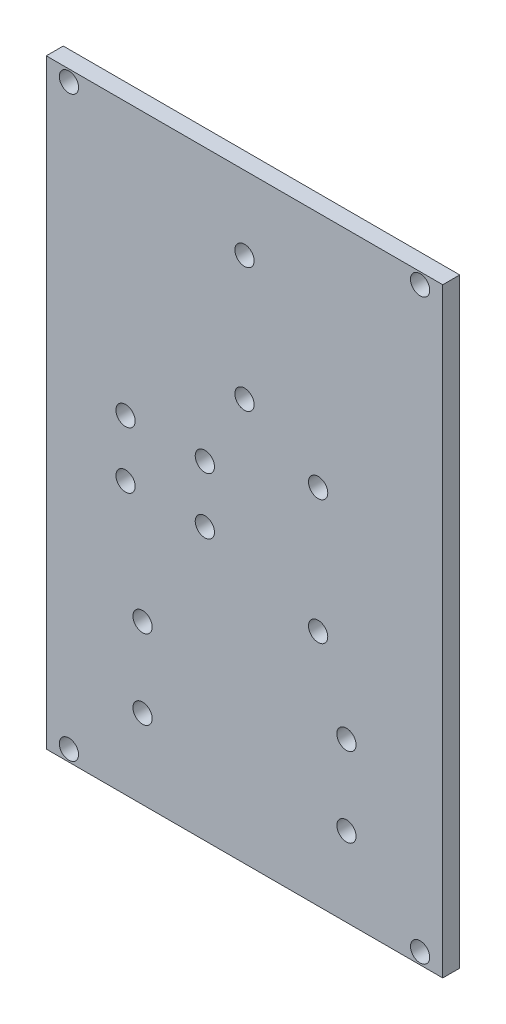
ISO-10303-21;
HEADER;
FILE_DESCRIPTION(('STEP AP214'),'2;1');
FILE_NAME('part.step','',(''),(''),'','','');
FILE_SCHEMA(('AUTOMOTIVE_DESIGN { 1 0 10303 214 1 1 1 1 }'));
ENDSEC;
DATA;
#1=APPLICATION_CONTEXT('core data for automotive mechanical design processes');
#2=APPLICATION_PROTOCOL_DEFINITION('international standard','automotive_design',2000,#1);
#3=PRODUCT_CONTEXT('',#1,'mechanical');
#4=PRODUCT('Part','Part','',(#3));
#5=PRODUCT_RELATED_PRODUCT_CATEGORY('part','',(#4));
#6=PRODUCT_DEFINITION_FORMATION('','',#4);
#7=PRODUCT_DEFINITION_CONTEXT('part definition',#1,'design');
#8=PRODUCT_DEFINITION('design','',#6,#7);
#9=PRODUCT_DEFINITION_SHAPE('','',#8);
#10=(LENGTH_UNIT() NAMED_UNIT(*) SI_UNIT(.MILLI.,.METRE.));
#11=(NAMED_UNIT(*) PLANE_ANGLE_UNIT() SI_UNIT($,.RADIAN.));
#12=(NAMED_UNIT(*) SI_UNIT($,.STERADIAN.) SOLID_ANGLE_UNIT());
#13=UNCERTAINTY_MEASURE_WITH_UNIT(LENGTH_MEASURE(1.E-05),#10,'distance_accuracy_value','');
#14=(GEOMETRIC_REPRESENTATION_CONTEXT(3) GLOBAL_UNCERTAINTY_ASSIGNED_CONTEXT((#13)) GLOBAL_UNIT_ASSIGNED_CONTEXT((#10,
#11,#12)) REPRESENTATION_CONTEXT('',''));
#15=CARTESIAN_POINT('',(0.,0.,0.));
#16=DIRECTION('',(0.,0.,1.));
#17=DIRECTION('',(1.,0.,0.));
#18=AXIS2_PLACEMENT_3D('',#15,#16,#17);
#19=CARTESIAN_POINT('',(-238.,53.,85.));
#20=DIRECTION('',(-1.,0.,0.));
#21=DIRECTION('',(0.,0.,1.));
#22=AXIS2_PLACEMENT_3D('',#19,#20,#21);
#23=PLANE('',#22);
#24=DIRECTION('',(0.,-1.,0.));
#25=VECTOR('',#24,1.);
#26=CARTESIAN_POINT('',(-238.,53.,88.));
#27=LINE('',#26,#25);
#28=CARTESIAN_POINT('',(-238.,53.,88.));
#29=VERTEX_POINT('',#28);
#30=CARTESIAN_POINT('',(-238.,-53.,88.));
#31=VERTEX_POINT('',#30);
#32=EDGE_CURVE('E106',#29,#31,#27,.T.);
#33=ORIENTED_EDGE('',*,*,#32,.F.);
#34=DIRECTION('',(0.,0.,1.));
#35=VECTOR('',#34,1.);
#36=CARTESIAN_POINT('',(-238.,53.,85.));
#37=LINE('',#36,#35);
#38=CARTESIAN_POINT('',(-238.,53.,85.));
#39=VERTEX_POINT('',#38);
#40=EDGE_CURVE('E11',#39,#29,#37,.T.);
#41=ORIENTED_EDGE('',*,*,#40,.F.);
#42=DIRECTION('',(0.,-1.,0.));
#43=VECTOR('',#42,1.);
#44=CARTESIAN_POINT('',(-238.,53.,85.));
#45=LINE('',#44,#43);
#46=CARTESIAN_POINT('',(-238.,-53.,85.));
#47=VERTEX_POINT('',#46);
#48=EDGE_CURVE('E97',#39,#47,#45,.T.);
#49=ORIENTED_EDGE('',*,*,#48,.T.);
#50=DIRECTION('',(0.,0.,1.));
#51=VECTOR('',#50,1.);
#52=CARTESIAN_POINT('',(-238.,-53.,85.));
#53=LINE('',#52,#51);
#54=EDGE_CURVE('E42',#47,#31,#53,.T.);
#55=ORIENTED_EDGE('',*,*,#54,.T.);
#56=EDGE_LOOP('',(#33,#41,#49,#55));
#57=FACE_BOUND('',#56,.T.);
#58=ADVANCED_FACE('F41',(#57),#23,.T.);
#59=CARTESIAN_POINT('',(-238.,53.,85.));
#60=DIRECTION('',(0.,1.,0.));
#61=DIRECTION('',(0.,0.,1.));
#62=AXIS2_PLACEMENT_3D('',#59,#60,#61);
#63=PLANE('',#62);
#64=DIRECTION('',(-1.,0.,0.));
#65=VECTOR('',#64,1.);
#66=CARTESIAN_POINT('',(-238.,53.,88.));
#67=LINE('',#66,#65);
#68=CARTESIAN_POINT('',(-168.,53.,88.));
#69=VERTEX_POINT('',#68);
#70=EDGE_CURVE('E101',#69,#29,#67,.T.);
#71=ORIENTED_EDGE('',*,*,#70,.F.);
#72=DIRECTION('',(0.,0.,1.));
#73=VECTOR('',#72,1.);
#74=CARTESIAN_POINT('',(-168.,53.,85.));
#75=LINE('',#74,#73);
#76=CARTESIAN_POINT('',(-168.,53.,85.));
#77=VERTEX_POINT('',#76);
#78=EDGE_CURVE('E49',#77,#69,#75,.T.);
#79=ORIENTED_EDGE('',*,*,#78,.F.);
#80=DIRECTION('',(-1.,0.,0.));
#81=VECTOR('',#80,1.);
#82=CARTESIAN_POINT('',(-238.,53.,85.));
#83=LINE('',#82,#81);
#84=EDGE_CURVE('E96',#77,#39,#83,.T.);
#85=ORIENTED_EDGE('',*,*,#84,.T.);
#86=ORIENTED_EDGE('',*,*,#40,.T.);
#87=EDGE_LOOP('',(#71,#79,#85,#86));
#88=FACE_BOUND('',#87,.T.);
#89=ADVANCED_FACE('F120',(#88),#63,.T.);
#90=CARTESIAN_POINT('',(-168.,53.,85.));
#91=DIRECTION('',(1.,0.,0.));
#92=DIRECTION('',(0.,0.,-1.));
#93=AXIS2_PLACEMENT_3D('',#90,#91,#92);
#94=PLANE('',#93);
#95=DIRECTION('',(0.,1.,0.));
#96=VECTOR('',#95,1.);
#97=CARTESIAN_POINT('',(-168.,53.,88.));
#98=LINE('',#97,#96);
#99=CARTESIAN_POINT('',(-168.,-53.,88.));
#100=VERTEX_POINT('',#99);
#101=EDGE_CURVE('E93',#100,#69,#98,.T.);
#102=ORIENTED_EDGE('',*,*,#101,.F.);
#103=DIRECTION('',(0.,0.,1.));
#104=VECTOR('',#103,1.);
#105=CARTESIAN_POINT('',(-168.,-53.,85.));
#106=LINE('',#105,#104);
#107=CARTESIAN_POINT('',(-168.,-53.,85.));
#108=VERTEX_POINT('',#107);
#109=EDGE_CURVE('E88',#108,#100,#106,.T.);
#110=ORIENTED_EDGE('',*,*,#109,.F.);
#111=DIRECTION('',(0.,1.,0.));
#112=VECTOR('',#111,1.);
#113=CARTESIAN_POINT('',(-168.,53.,85.));
#114=LINE('',#113,#112);
#115=EDGE_CURVE('E90',#108,#77,#114,.T.);
#116=ORIENTED_EDGE('',*,*,#115,.T.);
#117=ORIENTED_EDGE('',*,*,#78,.T.);
#118=EDGE_LOOP('',(#102,#110,#116,#117));
#119=FACE_BOUND('',#118,.T.);
#120=ADVANCED_FACE('F86',(#119),#94,.T.);
#121=CARTESIAN_POINT('',(-238.,-53.,85.));
#122=DIRECTION('',(0.,-1.,0.));
#123=DIRECTION('',(0.,0.,-1.));
#124=AXIS2_PLACEMENT_3D('',#121,#122,#123);
#125=PLANE('',#124);
#126=DIRECTION('',(1.,0.,0.));
#127=VECTOR('',#126,1.);
#128=CARTESIAN_POINT('',(-238.,-53.,88.));
#129=LINE('',#128,#127);
#130=EDGE_CURVE('E108',#31,#100,#129,.T.);
#131=ORIENTED_EDGE('',*,*,#130,.F.);
#132=ORIENTED_EDGE('',*,*,#54,.F.);
#133=DIRECTION('',(1.,0.,0.));
#134=VECTOR('',#133,1.);
#135=CARTESIAN_POINT('',(-238.,-53.,85.));
#136=LINE('',#135,#134);
#137=EDGE_CURVE('E92',#47,#108,#136,.T.);
#138=ORIENTED_EDGE('',*,*,#137,.T.);
#139=ORIENTED_EDGE('',*,*,#109,.T.);
#140=EDGE_LOOP('',(#131,#132,#138,#139));
#141=FACE_BOUND('',#140,.T.);
#142=ADVANCED_FACE('F98',(#141),#125,.T.);
#143=CARTESIAN_POINT('',(0.,0.,85.));
#144=DIRECTION('',(0.,0.,1.));
#145=DIRECTION('',(1.,0.,0.));
#146=AXIS2_PLACEMENT_3D('',#143,#144,#145);
#147=PLANE('',#146);
#148=CARTESIAN_POINT('',(-172.,51.,85.));
#149=DIRECTION('',(0.,0.,1.));
#150=DIRECTION('',(1.,0.,0.));
#151=AXIS2_PLACEMENT_3D('',#148,#149,#150);
#152=CIRCLE('',#151,1.70000000000001);
#153=CARTESIAN_POINT('',(-170.3,51.,85.));
#154=VERTEX_POINT('',#153);
#155=EDGE_CURVE('E206',#154,#154,#152,.T.);
#156=ORIENTED_EDGE('',*,*,#155,.T.);
#157=EDGE_LOOP('',(#156));
#158=FACE_BOUND('',#157,.T.);
#159=CARTESIAN_POINT('',(-203.,40.,85.));
#160=DIRECTION('',(0.,0.,1.));
#161=DIRECTION('',(1.,0.,0.));
#162=AXIS2_PLACEMENT_3D('',#159,#160,#161);
#163=CIRCLE('',#162,1.70000000000001);
#164=CARTESIAN_POINT('',(-201.3,40.,85.));
#165=VERTEX_POINT('',#164);
#166=EDGE_CURVE('E212',#165,#165,#163,.T.);
#167=ORIENTED_EDGE('',*,*,#166,.T.);
#168=EDGE_LOOP('',(#167));
#169=FACE_BOUND('',#168,.T.);
#170=CARTESIAN_POINT('',(-203.,18.,85.));
#171=DIRECTION('',(0.,0.,1.));
#172=DIRECTION('',(1.,0.,0.));
#173=AXIS2_PLACEMENT_3D('',#170,#171,#172);
#174=CIRCLE('',#173,1.70000000000001);
#175=CARTESIAN_POINT('',(-201.3,18.,85.));
#176=VERTEX_POINT('',#175);
#177=EDGE_CURVE('E219',#176,#176,#174,.T.);
#178=ORIENTED_EDGE('',*,*,#177,.T.);
#179=EDGE_LOOP('',(#178));
#180=FACE_BOUND('',#179,.T.);
#181=CARTESIAN_POINT('',(-190.,11.,85.));
#182=DIRECTION('',(0.,0.,1.));
#183=DIRECTION('',(1.,0.,0.));
#184=AXIS2_PLACEMENT_3D('',#181,#182,#183);
#185=CIRCLE('',#184,1.70000000000001);
#186=CARTESIAN_POINT('',(-188.3,11.,85.));
#187=VERTEX_POINT('',#186);
#188=EDGE_CURVE('E227',#187,#187,#185,.T.);
#189=ORIENTED_EDGE('',*,*,#188,.T.);
#190=EDGE_LOOP('',(#189));
#191=FACE_BOUND('',#190,.T.);
#192=CARTESIAN_POINT('',(-234.,51.,85.));
#193=DIRECTION('',(0.,0.,1.));
#194=DIRECTION('',(1.,0.,0.));
#195=AXIS2_PLACEMENT_3D('',#192,#193,#194);
#196=CIRCLE('',#195,1.70000000000001);
#197=CARTESIAN_POINT('',(-232.3,51.,85.));
#198=VERTEX_POINT('',#197);
#199=EDGE_CURVE('E235',#198,#198,#196,.T.);
#200=ORIENTED_EDGE('',*,*,#199,.T.);
#201=EDGE_LOOP('',(#200));
#202=FACE_BOUND('',#201,.T.);
#203=CARTESIAN_POINT('',(-210.,5.,85.));
#204=DIRECTION('',(0.,0.,1.));
#205=DIRECTION('',(1.,0.,0.));
#206=AXIS2_PLACEMENT_3D('',#203,#204,#205);
#207=CIRCLE('',#206,1.70000000000001);
#208=CARTESIAN_POINT('',(-208.3,5.,85.));
#209=VERTEX_POINT('',#208);
#210=EDGE_CURVE('E236',#209,#209,#207,.T.);
#211=ORIENTED_EDGE('',*,*,#210,.T.);
#212=EDGE_LOOP('',(#211));
#213=FACE_BOUND('',#212,.T.);
#214=CARTESIAN_POINT('',(-224.,5.,85.));
#215=DIRECTION('',(0.,0.,1.));
#216=DIRECTION('',(1.,0.,0.));
#217=AXIS2_PLACEMENT_3D('',#214,#215,#216);
#218=CIRCLE('',#217,1.70000000000001);
#219=CARTESIAN_POINT('',(-222.3,5.,85.));
#220=VERTEX_POINT('',#219);
#221=EDGE_CURVE('E241',#220,#220,#218,.T.);
#222=ORIENTED_EDGE('',*,*,#221,.T.);
#223=EDGE_LOOP('',(#222));
#224=FACE_BOUND('',#223,.T.);
#225=CARTESIAN_POINT('',(-185.,-25.,85.));
#226=DIRECTION('',(0.,0.,1.));
#227=DIRECTION('',(1.,0.,0.));
#228=AXIS2_PLACEMENT_3D('',#225,#226,#227);
#229=CIRCLE('',#228,1.70000000000001);
#230=CARTESIAN_POINT('',(-183.3,-25.,85.));
#231=VERTEX_POINT('',#230);
#232=EDGE_CURVE('E248',#231,#231,#229,.T.);
#233=ORIENTED_EDGE('',*,*,#232,.T.);
#234=EDGE_LOOP('',(#233));
#235=FACE_BOUND('',#234,.T.);
#236=CARTESIAN_POINT('',(-190.,-11.,85.));
#237=DIRECTION('',(0.,0.,1.));
#238=DIRECTION('',(1.,0.,0.));
#239=AXIS2_PLACEMENT_3D('',#236,#237,#238);
#240=CIRCLE('',#239,1.70000000000001);
#241=CARTESIAN_POINT('',(-188.3,-11.,85.));
#242=VERTEX_POINT('',#241);
#243=EDGE_CURVE('E258',#242,#242,#240,.T.);
#244=ORIENTED_EDGE('',*,*,#243,.T.);
#245=EDGE_LOOP('',(#244));
#246=FACE_BOUND('',#245,.T.);
#247=CARTESIAN_POINT('',(-185.,-39.,85.));
#248=DIRECTION('',(0.,0.,1.));
#249=DIRECTION('',(1.,0.,0.));
#250=AXIS2_PLACEMENT_3D('',#247,#248,#249);
#251=CIRCLE('',#250,1.70000000000001);
#252=CARTESIAN_POINT('',(-183.3,-39.,85.));
#253=VERTEX_POINT('',#252);
#254=EDGE_CURVE('E265',#253,#253,#251,.T.);
#255=ORIENTED_EDGE('',*,*,#254,.T.);
#256=EDGE_LOOP('',(#255));
#257=FACE_BOUND('',#256,.T.);
#258=CARTESIAN_POINT('',(-172.,-51.,85.));
#259=DIRECTION('',(0.,0.,1.));
#260=DIRECTION('',(1.,0.,0.));
#261=AXIS2_PLACEMENT_3D('',#258,#259,#260);
#262=CIRCLE('',#261,1.70000000000001);
#263=CARTESIAN_POINT('',(-170.3,-51.,85.));
#264=VERTEX_POINT('',#263);
#265=EDGE_CURVE('E268',#264,#264,#262,.T.);
#266=ORIENTED_EDGE('',*,*,#265,.T.);
#267=EDGE_LOOP('',(#266));
#268=FACE_BOUND('',#267,.T.);
#269=CARTESIAN_POINT('',(-210.,-5.,85.));
#270=DIRECTION('',(0.,0.,1.));
#271=DIRECTION('',(1.,0.,0.));
#272=AXIS2_PLACEMENT_3D('',#269,#270,#271);
#273=CIRCLE('',#272,1.70000000000001);
#274=CARTESIAN_POINT('',(-208.3,-5.,85.));
#275=VERTEX_POINT('',#274);
#276=EDGE_CURVE('E273',#275,#275,#273,.T.);
#277=ORIENTED_EDGE('',*,*,#276,.T.);
#278=EDGE_LOOP('',(#277));
#279=FACE_BOUND('',#278,.T.);
#280=CARTESIAN_POINT('',(-224.,-5.,85.));
#281=DIRECTION('',(0.,0.,1.));
#282=DIRECTION('',(1.,0.,0.));
#283=AXIS2_PLACEMENT_3D('',#280,#281,#282);
#284=CIRCLE('',#283,1.70000000000001);
#285=CARTESIAN_POINT('',(-222.3,-5.,85.));
#286=VERTEX_POINT('',#285);
#287=EDGE_CURVE('E278',#286,#286,#284,.T.);
#288=ORIENTED_EDGE('',*,*,#287,.T.);
#289=EDGE_LOOP('',(#288));
#290=FACE_BOUND('',#289,.T.);
#291=CARTESIAN_POINT('',(-221.,-25.,85.));
#292=DIRECTION('',(0.,0.,1.));
#293=DIRECTION('',(1.,0.,0.));
#294=AXIS2_PLACEMENT_3D('',#291,#292,#293);
#295=CIRCLE('',#294,1.70000000000001);
#296=CARTESIAN_POINT('',(-219.3,-25.,85.));
#297=VERTEX_POINT('',#296);
#298=EDGE_CURVE('E287',#297,#297,#295,.T.);
#299=ORIENTED_EDGE('',*,*,#298,.T.);
#300=EDGE_LOOP('',(#299));
#301=FACE_BOUND('',#300,.T.);
#302=CARTESIAN_POINT('',(-221.,-39.,85.));
#303=DIRECTION('',(0.,0.,1.));
#304=DIRECTION('',(1.,0.,0.));
#305=AXIS2_PLACEMENT_3D('',#302,#303,#304);
#306=CIRCLE('',#305,1.70000000000001);
#307=CARTESIAN_POINT('',(-219.3,-39.,85.));
#308=VERTEX_POINT('',#307);
#309=EDGE_CURVE('E295',#308,#308,#306,.T.);
#310=ORIENTED_EDGE('',*,*,#309,.T.);
#311=EDGE_LOOP('',(#310));
#312=FACE_BOUND('',#311,.T.);
#313=CARTESIAN_POINT('',(-234.,-51.,85.));
#314=DIRECTION('',(0.,0.,1.));
#315=DIRECTION('',(1.,0.,0.));
#316=AXIS2_PLACEMENT_3D('',#313,#314,#315);
#317=CIRCLE('',#316,1.70000000000001);
#318=CARTESIAN_POINT('',(-232.3,-51.,85.));
#319=VERTEX_POINT('',#318);
#320=EDGE_CURVE('E109',#319,#319,#317,.T.);
#321=ORIENTED_EDGE('',*,*,#320,.T.);
#322=EDGE_LOOP('',(#321));
#323=FACE_BOUND('',#322,.T.);
#324=ORIENTED_EDGE('',*,*,#48,.F.);
#325=ORIENTED_EDGE('',*,*,#84,.F.);
#326=ORIENTED_EDGE('',*,*,#115,.F.);
#327=ORIENTED_EDGE('',*,*,#137,.F.);
#328=EDGE_LOOP('',(#324,#325,#326,#327));
#329=FACE_BOUND('',#328,.T.);
#330=ADVANCED_FACE('F94',(#158,#169,#180,#191,#202,#213,#224,#235,#246,#257,#268,#279,#290,#301,
#312,#323,#329),#147,.F.);
#331=CARTESIAN_POINT('',(0.,0.,88.));
#332=DIRECTION('',(0.,0.,1.));
#333=DIRECTION('',(1.,0.,0.));
#334=AXIS2_PLACEMENT_3D('',#331,#332,#333);
#335=PLANE('',#334);
#336=CARTESIAN_POINT('',(-172.,51.,88.));
#337=DIRECTION('',(0.,0.,1.));
#338=DIRECTION('',(1.,0.,0.));
#339=AXIS2_PLACEMENT_3D('',#336,#337,#338);
#340=CIRCLE('',#339,1.70000000000001);
#341=CARTESIAN_POINT('',(-170.3,51.,88.));
#342=VERTEX_POINT('',#341);
#343=EDGE_CURVE('E207',#342,#342,#340,.T.);
#344=ORIENTED_EDGE('',*,*,#343,.F.);
#345=EDGE_LOOP('',(#344));
#346=FACE_BOUND('',#345,.T.);
#347=CARTESIAN_POINT('',(-203.,40.,88.));
#348=DIRECTION('',(0.,0.,1.));
#349=DIRECTION('',(1.,0.,0.));
#350=AXIS2_PLACEMENT_3D('',#347,#348,#349);
#351=CIRCLE('',#350,1.70000000000001);
#352=CARTESIAN_POINT('',(-201.3,40.,88.));
#353=VERTEX_POINT('',#352);
#354=EDGE_CURVE('E211',#353,#353,#351,.T.);
#355=ORIENTED_EDGE('',*,*,#354,.F.);
#356=EDGE_LOOP('',(#355));
#357=FACE_BOUND('',#356,.T.);
#358=CARTESIAN_POINT('',(-203.,18.,88.));
#359=DIRECTION('',(0.,0.,1.));
#360=DIRECTION('',(1.,0.,0.));
#361=AXIS2_PLACEMENT_3D('',#358,#359,#360);
#362=CIRCLE('',#361,1.70000000000001);
#363=CARTESIAN_POINT('',(-201.3,18.,88.));
#364=VERTEX_POINT('',#363);
#365=EDGE_CURVE('E220',#364,#364,#362,.T.);
#366=ORIENTED_EDGE('',*,*,#365,.F.);
#367=EDGE_LOOP('',(#366));
#368=FACE_BOUND('',#367,.T.);
#369=CARTESIAN_POINT('',(-190.,11.,88.));
#370=DIRECTION('',(0.,0.,1.));
#371=DIRECTION('',(1.,0.,0.));
#372=AXIS2_PLACEMENT_3D('',#369,#370,#371);
#373=CIRCLE('',#372,1.70000000000001);
#374=CARTESIAN_POINT('',(-188.3,11.,88.));
#375=VERTEX_POINT('',#374);
#376=EDGE_CURVE('E224',#375,#375,#373,.T.);
#377=ORIENTED_EDGE('',*,*,#376,.F.);
#378=EDGE_LOOP('',(#377));
#379=FACE_BOUND('',#378,.T.);
#380=CARTESIAN_POINT('',(-234.,51.,88.));
#381=DIRECTION('',(0.,0.,1.));
#382=DIRECTION('',(1.,0.,0.));
#383=AXIS2_PLACEMENT_3D('',#380,#381,#382);
#384=CIRCLE('',#383,1.70000000000001);
#385=CARTESIAN_POINT('',(-232.3,51.,88.));
#386=VERTEX_POINT('',#385);
#387=EDGE_CURVE('E226',#386,#386,#384,.T.);
#388=ORIENTED_EDGE('',*,*,#387,.F.);
#389=EDGE_LOOP('',(#388));
#390=FACE_BOUND('',#389,.T.);
#391=CARTESIAN_POINT('',(-210.,5.,88.));
#392=DIRECTION('',(0.,0.,1.));
#393=DIRECTION('',(1.,0.,0.));
#394=AXIS2_PLACEMENT_3D('',#391,#392,#393);
#395=CIRCLE('',#394,1.70000000000001);
#396=CARTESIAN_POINT('',(-208.3,5.,88.));
#397=VERTEX_POINT('',#396);
#398=EDGE_CURVE('E233',#397,#397,#395,.T.);
#399=ORIENTED_EDGE('',*,*,#398,.F.);
#400=EDGE_LOOP('',(#399));
#401=FACE_BOUND('',#400,.T.);
#402=CARTESIAN_POINT('',(-224.,5.,88.));
#403=DIRECTION('',(0.,0.,1.));
#404=DIRECTION('',(1.,0.,0.));
#405=AXIS2_PLACEMENT_3D('',#402,#403,#404);
#406=CIRCLE('',#405,1.70000000000001);
#407=CARTESIAN_POINT('',(-222.3,5.,88.));
#408=VERTEX_POINT('',#407);
#409=EDGE_CURVE('E242',#408,#408,#406,.T.);
#410=ORIENTED_EDGE('',*,*,#409,.F.);
#411=EDGE_LOOP('',(#410));
#412=FACE_BOUND('',#411,.T.);
#413=CARTESIAN_POINT('',(-185.,-25.,88.));
#414=DIRECTION('',(0.,0.,1.));
#415=DIRECTION('',(1.,0.,0.));
#416=AXIS2_PLACEMENT_3D('',#413,#414,#415);
#417=CIRCLE('',#416,1.70000000000001);
#418=CARTESIAN_POINT('',(-183.3,-25.,88.));
#419=VERTEX_POINT('',#418);
#420=EDGE_CURVE('E250',#419,#419,#417,.T.);
#421=ORIENTED_EDGE('',*,*,#420,.F.);
#422=EDGE_LOOP('',(#421));
#423=FACE_BOUND('',#422,.T.);
#424=CARTESIAN_POINT('',(-190.,-11.,88.));
#425=DIRECTION('',(0.,0.,1.));
#426=DIRECTION('',(1.,0.,0.));
#427=AXIS2_PLACEMENT_3D('',#424,#425,#426);
#428=CIRCLE('',#427,1.70000000000001);
#429=CARTESIAN_POINT('',(-188.3,-11.,88.));
#430=VERTEX_POINT('',#429);
#431=EDGE_CURVE('E251',#430,#430,#428,.T.);
#432=ORIENTED_EDGE('',*,*,#431,.F.);
#433=EDGE_LOOP('',(#432));
#434=FACE_BOUND('',#433,.T.);
#435=CARTESIAN_POINT('',(-185.,-39.,88.));
#436=DIRECTION('',(0.,0.,1.));
#437=DIRECTION('',(1.,0.,0.));
#438=AXIS2_PLACEMENT_3D('',#435,#436,#437);
#439=CIRCLE('',#438,1.70000000000001);
#440=CARTESIAN_POINT('',(-183.3,-39.,88.));
#441=VERTEX_POINT('',#440);
#442=EDGE_CURVE('E259',#441,#441,#439,.T.);
#443=ORIENTED_EDGE('',*,*,#442,.F.);
#444=EDGE_LOOP('',(#443));
#445=FACE_BOUND('',#444,.T.);
#446=CARTESIAN_POINT('',(-172.,-51.,88.));
#447=DIRECTION('',(0.,0.,1.));
#448=DIRECTION('',(1.,0.,0.));
#449=AXIS2_PLACEMENT_3D('',#446,#447,#448);
#450=CIRCLE('',#449,1.70000000000001);
#451=CARTESIAN_POINT('',(-170.3,-51.,88.));
#452=VERTEX_POINT('',#451);
#453=EDGE_CURVE('E264',#452,#452,#450,.T.);
#454=ORIENTED_EDGE('',*,*,#453,.F.);
#455=EDGE_LOOP('',(#454));
#456=FACE_BOUND('',#455,.T.);
#457=CARTESIAN_POINT('',(-210.,-5.,88.));
#458=DIRECTION('',(0.,0.,1.));
#459=DIRECTION('',(1.,0.,0.));
#460=AXIS2_PLACEMENT_3D('',#457,#458,#459);
#461=CIRCLE('',#460,1.70000000000001);
#462=CARTESIAN_POINT('',(-208.3,-5.,88.));
#463=VERTEX_POINT('',#462);
#464=EDGE_CURVE('E271',#463,#463,#461,.T.);
#465=ORIENTED_EDGE('',*,*,#464,.F.);
#466=EDGE_LOOP('',(#465));
#467=FACE_BOUND('',#466,.T.);
#468=CARTESIAN_POINT('',(-224.,-5.,88.));
#469=DIRECTION('',(0.,0.,1.));
#470=DIRECTION('',(1.,0.,0.));
#471=AXIS2_PLACEMENT_3D('',#468,#469,#470);
#472=CIRCLE('',#471,1.70000000000001);
#473=CARTESIAN_POINT('',(-222.3,-5.,88.));
#474=VERTEX_POINT('',#473);
#475=EDGE_CURVE('E280',#474,#474,#472,.T.);
#476=ORIENTED_EDGE('',*,*,#475,.F.);
#477=EDGE_LOOP('',(#476));
#478=FACE_BOUND('',#477,.T.);
#479=CARTESIAN_POINT('',(-221.,-25.,88.));
#480=DIRECTION('',(0.,0.,1.));
#481=DIRECTION('',(1.,0.,0.));
#482=AXIS2_PLACEMENT_3D('',#479,#480,#481);
#483=CIRCLE('',#482,1.70000000000001);
#484=CARTESIAN_POINT('',(-219.3,-25.,88.));
#485=VERTEX_POINT('',#484);
#486=EDGE_CURVE('E284',#485,#485,#483,.T.);
#487=ORIENTED_EDGE('',*,*,#486,.F.);
#488=EDGE_LOOP('',(#487));
#489=FACE_BOUND('',#488,.T.);
#490=CARTESIAN_POINT('',(-221.,-39.,88.));
#491=DIRECTION('',(0.,0.,1.));
#492=DIRECTION('',(1.,0.,0.));
#493=AXIS2_PLACEMENT_3D('',#490,#491,#492);
#494=CIRCLE('',#493,1.70000000000001);
#495=CARTESIAN_POINT('',(-219.3,-39.,88.));
#496=VERTEX_POINT('',#495);
#497=EDGE_CURVE('E286',#496,#496,#494,.T.);
#498=ORIENTED_EDGE('',*,*,#497,.F.);
#499=EDGE_LOOP('',(#498));
#500=FACE_BOUND('',#499,.T.);
#501=CARTESIAN_POINT('',(-234.,-51.,88.));
#502=DIRECTION('',(0.,0.,1.));
#503=DIRECTION('',(1.,0.,0.));
#504=AXIS2_PLACEMENT_3D('',#501,#502,#503);
#505=CIRCLE('',#504,1.70000000000001);
#506=CARTESIAN_POINT('',(-232.3,-51.,88.));
#507=VERTEX_POINT('',#506);
#508=EDGE_CURVE('E293',#507,#507,#505,.T.);
#509=ORIENTED_EDGE('',*,*,#508,.F.);
#510=EDGE_LOOP('',(#509));
#511=FACE_BOUND('',#510,.T.);
#512=ORIENTED_EDGE('',*,*,#32,.T.);
#513=ORIENTED_EDGE('',*,*,#130,.T.);
#514=ORIENTED_EDGE('',*,*,#101,.T.);
#515=ORIENTED_EDGE('',*,*,#70,.T.);
#516=EDGE_LOOP('',(#512,#513,#514,#515));
#517=FACE_BOUND('',#516,.T.);
#518=ADVANCED_FACE('F117',(#346,#357,#368,#379,#390,#401,#412,#423,#434,#445,#456,#467,#478,
#489,#500,#511,#517),#335,.T.);
#519=CARTESIAN_POINT('',(-234.,-51.,85.));
#520=DIRECTION('',(0.,0.,1.));
#521=DIRECTION('',(1.,0.,0.));
#522=AXIS2_PLACEMENT_3D('',#519,#520,#521);
#523=CYLINDRICAL_SURFACE('',#522,1.70000000000001);
#524=ORIENTED_EDGE('',*,*,#320,.F.);
#525=EDGE_LOOP('',(#524));
#526=FACE_BOUND('',#525,.T.);
#527=ORIENTED_EDGE('',*,*,#508,.T.);
#528=EDGE_LOOP('',(#527));
#529=FACE_BOUND('',#528,.T.);
#530=ADVANCED_FACE('F133',(#526,#529),#523,.F.);
#531=CARTESIAN_POINT('',(-221.,-39.,85.));
#532=DIRECTION('',(0.,0.,1.));
#533=DIRECTION('',(1.,0.,0.));
#534=AXIS2_PLACEMENT_3D('',#531,#532,#533);
#535=CYLINDRICAL_SURFACE('',#534,1.70000000000001);
#536=ORIENTED_EDGE('',*,*,#309,.F.);
#537=EDGE_LOOP('',(#536));
#538=FACE_BOUND('',#537,.T.);
#539=ORIENTED_EDGE('',*,*,#497,.T.);
#540=EDGE_LOOP('',(#539));
#541=FACE_BOUND('',#540,.T.);
#542=ADVANCED_FACE('F142',(#538,#541),#535,.F.);
#543=CARTESIAN_POINT('',(-221.,-25.,85.));
#544=DIRECTION('',(0.,0.,1.));
#545=DIRECTION('',(1.,0.,0.));
#546=AXIS2_PLACEMENT_3D('',#543,#544,#545);
#547=CYLINDRICAL_SURFACE('',#546,1.70000000000001);
#548=ORIENTED_EDGE('',*,*,#298,.F.);
#549=EDGE_LOOP('',(#548));
#550=FACE_BOUND('',#549,.T.);
#551=ORIENTED_EDGE('',*,*,#486,.T.);
#552=EDGE_LOOP('',(#551));
#553=FACE_BOUND('',#552,.T.);
#554=ADVANCED_FACE('F148',(#550,#553),#547,.F.);
#555=CARTESIAN_POINT('',(-224.,-5.,85.));
#556=DIRECTION('',(0.,0.,1.));
#557=DIRECTION('',(1.,0.,0.));
#558=AXIS2_PLACEMENT_3D('',#555,#556,#557);
#559=CYLINDRICAL_SURFACE('',#558,1.70000000000001);
#560=ORIENTED_EDGE('',*,*,#287,.F.);
#561=EDGE_LOOP('',(#560));
#562=FACE_BOUND('',#561,.T.);
#563=ORIENTED_EDGE('',*,*,#475,.T.);
#564=EDGE_LOOP('',(#563));
#565=FACE_BOUND('',#564,.T.);
#566=ADVANCED_FACE('F147',(#562,#565),#559,.F.);
#567=CARTESIAN_POINT('',(-210.,-5.,85.));
#568=DIRECTION('',(0.,0.,1.));
#569=DIRECTION('',(1.,0.,0.));
#570=AXIS2_PLACEMENT_3D('',#567,#568,#569);
#571=CYLINDRICAL_SURFACE('',#570,1.70000000000001);
#572=ORIENTED_EDGE('',*,*,#276,.F.);
#573=EDGE_LOOP('',(#572));
#574=FACE_BOUND('',#573,.T.);
#575=ORIENTED_EDGE('',*,*,#464,.T.);
#576=EDGE_LOOP('',(#575));
#577=FACE_BOUND('',#576,.T.);
#578=ADVANCED_FACE('F152',(#574,#577),#571,.F.);
#579=CARTESIAN_POINT('',(-172.,-51.,85.));
#580=DIRECTION('',(0.,0.,1.));
#581=DIRECTION('',(1.,0.,0.));
#582=AXIS2_PLACEMENT_3D('',#579,#580,#581);
#583=CYLINDRICAL_SURFACE('',#582,1.70000000000001);
#584=ORIENTED_EDGE('',*,*,#265,.F.);
#585=EDGE_LOOP('',(#584));
#586=FACE_BOUND('',#585,.T.);
#587=ORIENTED_EDGE('',*,*,#453,.T.);
#588=EDGE_LOOP('',(#587));
#589=FACE_BOUND('',#588,.T.);
#590=ADVANCED_FACE('F158',(#586,#589),#583,.F.);
#591=CARTESIAN_POINT('',(-185.,-39.,85.));
#592=DIRECTION('',(0.,0.,1.));
#593=DIRECTION('',(1.,0.,0.));
#594=AXIS2_PLACEMENT_3D('',#591,#592,#593);
#595=CYLINDRICAL_SURFACE('',#594,1.70000000000001);
#596=ORIENTED_EDGE('',*,*,#254,.F.);
#597=EDGE_LOOP('',(#596));
#598=FACE_BOUND('',#597,.T.);
#599=ORIENTED_EDGE('',*,*,#442,.T.);
#600=EDGE_LOOP('',(#599));
#601=FACE_BOUND('',#600,.T.);
#602=ADVANCED_FACE('F165',(#598,#601),#595,.F.);
#603=CARTESIAN_POINT('',(-190.,-11.,85.));
#604=DIRECTION('',(0.,0.,1.));
#605=DIRECTION('',(1.,0.,0.));
#606=AXIS2_PLACEMENT_3D('',#603,#604,#605);
#607=CYLINDRICAL_SURFACE('',#606,1.70000000000001);
#608=ORIENTED_EDGE('',*,*,#243,.F.);
#609=EDGE_LOOP('',(#608));
#610=FACE_BOUND('',#609,.T.);
#611=ORIENTED_EDGE('',*,*,#431,.T.);
#612=EDGE_LOOP('',(#611));
#613=FACE_BOUND('',#612,.T.);
#614=ADVANCED_FACE('F167',(#610,#613),#607,.F.);
#615=CARTESIAN_POINT('',(-185.,-25.,85.));
#616=DIRECTION('',(0.,0.,1.));
#617=DIRECTION('',(1.,0.,0.));
#618=AXIS2_PLACEMENT_3D('',#615,#616,#617);
#619=CYLINDRICAL_SURFACE('',#618,1.70000000000001);
#620=ORIENTED_EDGE('',*,*,#232,.F.);
#621=EDGE_LOOP('',(#620));
#622=FACE_BOUND('',#621,.T.);
#623=ORIENTED_EDGE('',*,*,#420,.T.);
#624=EDGE_LOOP('',(#623));
#625=FACE_BOUND('',#624,.T.);
#626=ADVANCED_FACE('F168',(#622,#625),#619,.F.);
#627=CARTESIAN_POINT('',(-224.,5.,85.));
#628=DIRECTION('',(0.,0.,1.));
#629=DIRECTION('',(1.,0.,0.));
#630=AXIS2_PLACEMENT_3D('',#627,#628,#629);
#631=CYLINDRICAL_SURFACE('',#630,1.70000000000001);
#632=ORIENTED_EDGE('',*,*,#221,.F.);
#633=EDGE_LOOP('',(#632));
#634=FACE_BOUND('',#633,.T.);
#635=ORIENTED_EDGE('',*,*,#409,.T.);
#636=EDGE_LOOP('',(#635));
#637=FACE_BOUND('',#636,.T.);
#638=ADVANCED_FACE('F171',(#634,#637),#631,.F.);
#639=CARTESIAN_POINT('',(-210.,5.,85.));
#640=DIRECTION('',(0.,0.,1.));
#641=DIRECTION('',(1.,0.,0.));
#642=AXIS2_PLACEMENT_3D('',#639,#640,#641);
#643=CYLINDRICAL_SURFACE('',#642,1.70000000000001);
#644=ORIENTED_EDGE('',*,*,#210,.F.);
#645=EDGE_LOOP('',(#644));
#646=FACE_BOUND('',#645,.T.);
#647=ORIENTED_EDGE('',*,*,#398,.T.);
#648=EDGE_LOOP('',(#647));
#649=FACE_BOUND('',#648,.T.);
#650=ADVANCED_FACE('F179',(#646,#649),#643,.F.);
#651=CARTESIAN_POINT('',(-234.,51.,85.));
#652=DIRECTION('',(0.,0.,1.));
#653=DIRECTION('',(1.,0.,0.));
#654=AXIS2_PLACEMENT_3D('',#651,#652,#653);
#655=CYLINDRICAL_SURFACE('',#654,1.70000000000001);
#656=ORIENTED_EDGE('',*,*,#199,.F.);
#657=EDGE_LOOP('',(#656));
#658=FACE_BOUND('',#657,.T.);
#659=ORIENTED_EDGE('',*,*,#387,.T.);
#660=EDGE_LOOP('',(#659));
#661=FACE_BOUND('',#660,.T.);
#662=ADVANCED_FACE('F185',(#658,#661),#655,.F.);
#663=CARTESIAN_POINT('',(-190.,11.,85.));
#664=DIRECTION('',(0.,0.,1.));
#665=DIRECTION('',(1.,0.,0.));
#666=AXIS2_PLACEMENT_3D('',#663,#664,#665);
#667=CYLINDRICAL_SURFACE('',#666,1.70000000000001);
#668=ORIENTED_EDGE('',*,*,#188,.F.);
#669=EDGE_LOOP('',(#668));
#670=FACE_BOUND('',#669,.T.);
#671=ORIENTED_EDGE('',*,*,#376,.T.);
#672=EDGE_LOOP('',(#671));
#673=FACE_BOUND('',#672,.T.);
#674=ADVANCED_FACE('F187',(#670,#673),#667,.F.);
#675=CARTESIAN_POINT('',(-203.,18.,85.));
#676=DIRECTION('',(0.,0.,1.));
#677=DIRECTION('',(1.,0.,0.));
#678=AXIS2_PLACEMENT_3D('',#675,#676,#677);
#679=CYLINDRICAL_SURFACE('',#678,1.70000000000001);
#680=ORIENTED_EDGE('',*,*,#177,.F.);
#681=EDGE_LOOP('',(#680));
#682=FACE_BOUND('',#681,.T.);
#683=ORIENTED_EDGE('',*,*,#365,.T.);
#684=EDGE_LOOP('',(#683));
#685=FACE_BOUND('',#684,.T.);
#686=ADVANCED_FACE('F188',(#682,#685),#679,.F.);
#687=CARTESIAN_POINT('',(-203.,40.,85.));
#688=DIRECTION('',(0.,0.,1.));
#689=DIRECTION('',(1.,0.,0.));
#690=AXIS2_PLACEMENT_3D('',#687,#688,#689);
#691=CYLINDRICAL_SURFACE('',#690,1.70000000000001);
#692=ORIENTED_EDGE('',*,*,#166,.F.);
#693=EDGE_LOOP('',(#692));
#694=FACE_BOUND('',#693,.T.);
#695=ORIENTED_EDGE('',*,*,#354,.T.);
#696=EDGE_LOOP('',(#695));
#697=FACE_BOUND('',#696,.T.);
#698=ADVANCED_FACE('F191',(#694,#697),#691,.F.);
#699=CARTESIAN_POINT('',(-172.,51.,85.));
#700=DIRECTION('',(0.,0.,1.));
#701=DIRECTION('',(1.,0.,0.));
#702=AXIS2_PLACEMENT_3D('',#699,#700,#701);
#703=CYLINDRICAL_SURFACE('',#702,1.70000000000001);
#704=ORIENTED_EDGE('',*,*,#155,.F.);
#705=EDGE_LOOP('',(#704));
#706=FACE_BOUND('',#705,.T.);
#707=ORIENTED_EDGE('',*,*,#343,.T.);
#708=EDGE_LOOP('',(#707));
#709=FACE_BOUND('',#708,.T.);
#710=ADVANCED_FACE('F196',(#706,#709),#703,.F.);
#711=CLOSED_SHELL('',(#58,#89,#120,#142,#330,#518,#530,#542,#554,#566,#578,#590,#602,#614,#626,
#638,#650,#662,#674,#686,#698,#710));
#712=MANIFOLD_SOLID_BREP('B2',#711);
#713=ADVANCED_BREP_SHAPE_REPRESENTATION('',(#18,#712),#14);
#714=SHAPE_DEFINITION_REPRESENTATION(#9,#713);
ENDSEC;
END-ISO-10303-21;
